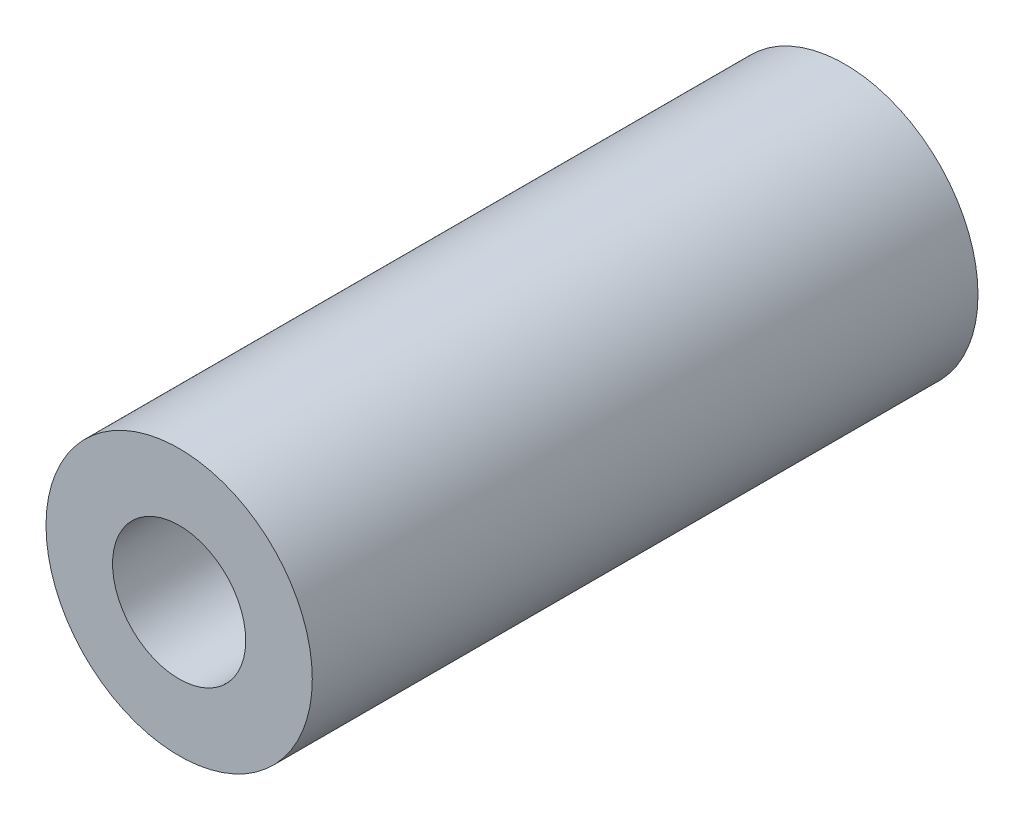
ISO-10303-21;
HEADER;
FILE_DESCRIPTION(('STEP AP214'),'2;1');
FILE_NAME('part.step','',(''),(''),'','','');
FILE_SCHEMA(('AUTOMOTIVE_DESIGN { 1 0 10303 214 1 1 1 1 }'));
ENDSEC;
DATA;
#1=APPLICATION_CONTEXT('core data for automotive mechanical design processes');
#2=APPLICATION_PROTOCOL_DEFINITION('international standard','automotive_design',2000,#1);
#3=PRODUCT_CONTEXT('',#1,'mechanical');
#4=PRODUCT('Part','Part','',(#3));
#5=PRODUCT_RELATED_PRODUCT_CATEGORY('part','',(#4));
#6=PRODUCT_DEFINITION_FORMATION('','',#4);
#7=PRODUCT_DEFINITION_CONTEXT('part definition',#1,'design');
#8=PRODUCT_DEFINITION('design','',#6,#7);
#9=PRODUCT_DEFINITION_SHAPE('','',#8);
#10=(LENGTH_UNIT() NAMED_UNIT(*) SI_UNIT(.MILLI.,.METRE.));
#11=(NAMED_UNIT(*) PLANE_ANGLE_UNIT() SI_UNIT($,.RADIAN.));
#12=(NAMED_UNIT(*) SI_UNIT($,.STERADIAN.) SOLID_ANGLE_UNIT());
#13=UNCERTAINTY_MEASURE_WITH_UNIT(LENGTH_MEASURE(1.E-05),#10,'distance_accuracy_value','');
#14=(GEOMETRIC_REPRESENTATION_CONTEXT(3) GLOBAL_UNCERTAINTY_ASSIGNED_CONTEXT((#13)) GLOBAL_UNIT_ASSIGNED_CONTEXT((#10,
#11,#12)) REPRESENTATION_CONTEXT('',''));
#15=CARTESIAN_POINT('',(0.,0.,0.));
#16=DIRECTION('',(0.,0.,1.));
#17=DIRECTION('',(1.,0.,0.));
#18=AXIS2_PLACEMENT_3D('',#15,#16,#17);
#19=CARTESIAN_POINT('',(0.,0.,10.));
#20=DIRECTION('',(0.,0.,1.));
#21=DIRECTION('',(1.,0.,0.));
#22=AXIS2_PLACEMENT_3D('',#19,#20,#21);
#23=PLANE('',#22);
#24=CARTESIAN_POINT('',(0.,0.,10.));
#25=DIRECTION('',(0.,0.,1.));
#26=DIRECTION('',(1.,0.,0.));
#27=AXIS2_PLACEMENT_3D('',#24,#25,#26);
#28=CIRCLE('',#27,2.);
#29=CARTESIAN_POINT('',(2.,0.,10.));
#30=VERTEX_POINT('',#29);
#31=EDGE_CURVE('E10',#30,#30,#28,.T.);
#32=ORIENTED_EDGE('',*,*,#31,.T.);
#33=EDGE_LOOP('',(#32));
#34=FACE_BOUND('',#33,.T.);
#35=CARTESIAN_POINT('',(0.,0.,10.));
#36=DIRECTION('',(0.,0.,1.));
#37=DIRECTION('',(1.,0.,0.));
#38=AXIS2_PLACEMENT_3D('',#35,#36,#37);
#39=CIRCLE('',#38,1.);
#40=CARTESIAN_POINT('',(1.,0.,10.));
#41=VERTEX_POINT('',#40);
#42=EDGE_CURVE('E42',#41,#41,#39,.T.);
#43=ORIENTED_EDGE('',*,*,#42,.F.);
#44=EDGE_LOOP('',(#43));
#45=FACE_BOUND('',#44,.T.);
#46=ADVANCED_FACE('F31',(#34,#45),#23,.T.);
#47=CARTESIAN_POINT('',(0.,0.,0.));
#48=DIRECTION('',(0.,0.,1.));
#49=DIRECTION('',(1.,0.,0.));
#50=AXIS2_PLACEMENT_3D('',#47,#48,#49);
#51=PLANE('',#50);
#52=CARTESIAN_POINT('',(0.,0.,0.));
#53=DIRECTION('',(0.,0.,1.));
#54=DIRECTION('',(1.,0.,0.));
#55=AXIS2_PLACEMENT_3D('',#52,#53,#54);
#56=CIRCLE('',#55,2.);
#57=CARTESIAN_POINT('',(2.,0.,0.));
#58=VERTEX_POINT('',#57);
#59=EDGE_CURVE('E35',#58,#58,#56,.T.);
#60=ORIENTED_EDGE('',*,*,#59,.F.);
#61=EDGE_LOOP('',(#60));
#62=FACE_BOUND('',#61,.T.);
#63=CARTESIAN_POINT('',(0.,0.,0.));
#64=DIRECTION('',(0.,0.,1.));
#65=DIRECTION('',(1.,0.,0.));
#66=AXIS2_PLACEMENT_3D('',#63,#64,#65);
#67=CIRCLE('',#66,1.);
#68=CARTESIAN_POINT('',(1.,0.,0.));
#69=VERTEX_POINT('',#68);
#70=EDGE_CURVE('E44',#69,#69,#67,.T.);
#71=ORIENTED_EDGE('',*,*,#70,.T.);
#72=EDGE_LOOP('',(#71));
#73=FACE_BOUND('',#72,.T.);
#74=ADVANCED_FACE('F54',(#62,#73),#51,.F.);
#75=CARTESIAN_POINT('',(0.,0.,10.));
#76=DIRECTION('',(0.,0.,-1.));
#77=DIRECTION('',(-1.,0.,0.));
#78=AXIS2_PLACEMENT_3D('',#75,#76,#77);
#79=CYLINDRICAL_SURFACE('',#78,2.);
#80=ORIENTED_EDGE('',*,*,#31,.F.);
#81=EDGE_LOOP('',(#80));
#82=FACE_BOUND('',#81,.T.);
#83=ORIENTED_EDGE('',*,*,#59,.T.);
#84=EDGE_LOOP('',(#83));
#85=FACE_BOUND('',#84,.T.);
#86=ADVANCED_FACE('F33',(#82,#85),#79,.T.);
#87=CARTESIAN_POINT('',(0.,0.,10.));
#88=DIRECTION('',(0.,0.,-1.));
#89=DIRECTION('',(-1.,0.,0.));
#90=AXIS2_PLACEMENT_3D('',#87,#88,#89);
#91=CYLINDRICAL_SURFACE('',#90,1.);
#92=ORIENTED_EDGE('',*,*,#42,.T.);
#93=EDGE_LOOP('',(#92));
#94=FACE_BOUND('',#93,.T.);
#95=ORIENTED_EDGE('',*,*,#70,.F.);
#96=EDGE_LOOP('',(#95));
#97=FACE_BOUND('',#96,.T.);
#98=ADVANCED_FACE('F50',(#94,#97),#91,.F.);
#99=CLOSED_SHELL('',(#46,#74,#86,#98));
#100=MANIFOLD_SOLID_BREP('B2',#99);
#101=ADVANCED_BREP_SHAPE_REPRESENTATION('',(#18,#100),#14);
#102=SHAPE_DEFINITION_REPRESENTATION(#9,#101);
ENDSEC;
END-ISO-10303-21;
